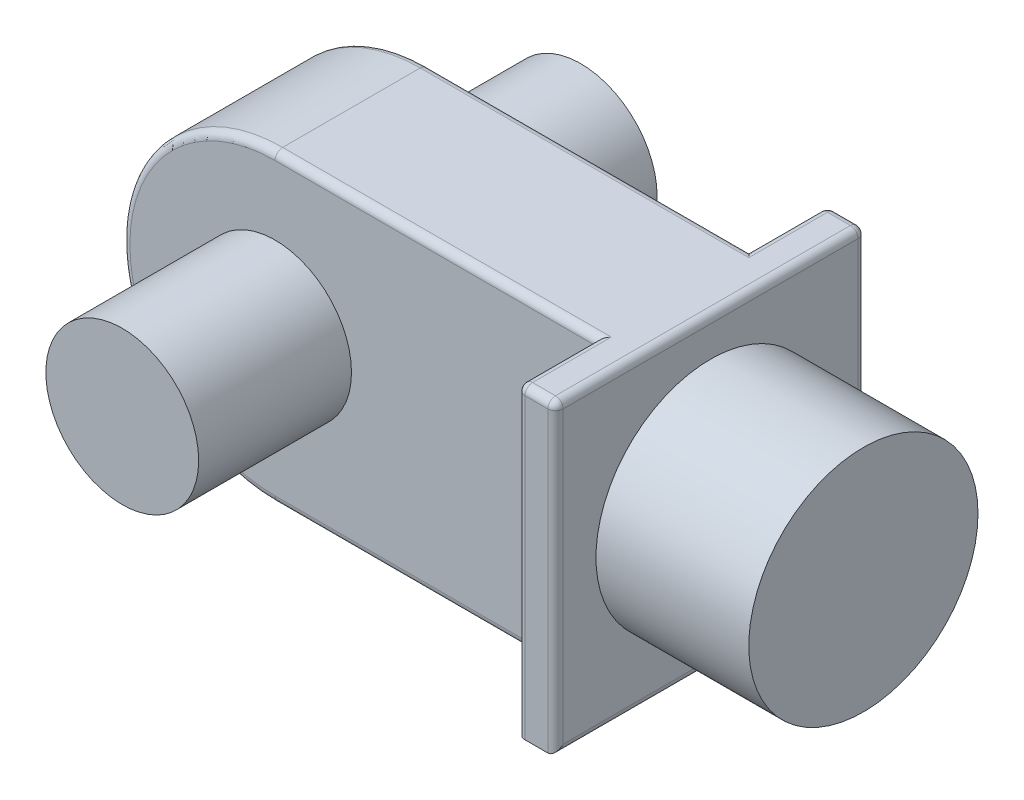
ISO-10303-21;
HEADER;
FILE_DESCRIPTION(('STEP AP214'),'2;1');
FILE_NAME('part.step','',(''),(''),'','','');
FILE_SCHEMA(('AUTOMOTIVE_DESIGN { 1 0 10303 214 1 1 1 1 }'));
ENDSEC;
DATA;
#1=APPLICATION_CONTEXT('core data for automotive mechanical design processes');
#2=APPLICATION_PROTOCOL_DEFINITION('international standard','automotive_design',2000,#1);
#3=PRODUCT_CONTEXT('',#1,'mechanical');
#4=PRODUCT('Part','Part','',(#3));
#5=PRODUCT_RELATED_PRODUCT_CATEGORY('part','',(#4));
#6=PRODUCT_DEFINITION_FORMATION('','',#4);
#7=PRODUCT_DEFINITION_CONTEXT('part definition',#1,'design');
#8=PRODUCT_DEFINITION('design','',#6,#7);
#9=PRODUCT_DEFINITION_SHAPE('','',#8);
#10=(LENGTH_UNIT() NAMED_UNIT(*) SI_UNIT(.MILLI.,.METRE.));
#11=(NAMED_UNIT(*) PLANE_ANGLE_UNIT() SI_UNIT($,.RADIAN.));
#12=(NAMED_UNIT(*) SI_UNIT($,.STERADIAN.) SOLID_ANGLE_UNIT());
#13=UNCERTAINTY_MEASURE_WITH_UNIT(LENGTH_MEASURE(1.E-05),#10,'distance_accuracy_value','');
#14=(GEOMETRIC_REPRESENTATION_CONTEXT(3) GLOBAL_UNCERTAINTY_ASSIGNED_CONTEXT((#13)) GLOBAL_UNIT_ASSIGNED_CONTEXT((#10,
#11,#12)) REPRESENTATION_CONTEXT('',''));
#15=CARTESIAN_POINT('',(0.,0.,0.));
#16=DIRECTION('',(0.,0.,1.));
#17=DIRECTION('',(1.,0.,0.));
#18=AXIS2_PLACEMENT_3D('',#15,#16,#17);
#19=CARTESIAN_POINT('',(-24.5588909208739,-0.00123831876589259,11.9999932178254));
#20=DIRECTION('',(0.,0.,-1.));
#21=DIRECTION('',(-1.,0.,0.));
#22=AXIS2_PLACEMENT_3D('',#19,#20,#21);
#23=CYLINDRICAL_SURFACE('',#22,4.);
#24=DIRECTION('',(0.,0.,-1.));
#25=VECTOR('',#24,1.);
#26=CARTESIAN_POINT('',(-24.5588909208739,-4.00123831876589,11.9999932178254));
#27=LINE('',#26,#25);
#28=CARTESIAN_POINT('',(-24.5588909208739,-4.00123831876589,11.7999932178254));
#29=VERTEX_POINT('',#28);
#30=CARTESIAN_POINT('',(-24.5588909208739,-4.00123831876589,8.19999321782536));
#31=VERTEX_POINT('',#30);
#32=EDGE_CURVE('E204',#29,#31,#27,.T.);
#33=ORIENTED_EDGE('',*,*,#32,.F.);
#34=CARTESIAN_POINT('',(-24.5588909208739,-0.00123831876589259,11.7999932178254));
#35=DIRECTION('',(0.,0.,1.));
#36=DIRECTION('',(1.,0.,0.));
#37=AXIS2_PLACEMENT_3D('',#34,#35,#36);
#38=CIRCLE('',#37,4.);
#39=CARTESIAN_POINT('',(-24.5588909208739,3.99876168123411,11.7999932178254));
#40=VERTEX_POINT('',#39);
#41=EDGE_CURVE('E239',#29,#40,#38,.F.);
#42=ORIENTED_EDGE('',*,*,#41,.T.);
#43=DIRECTION('',(0.,0.,-1.));
#44=VECTOR('',#43,1.);
#45=CARTESIAN_POINT('',(-24.5588909208739,3.99876168123411,11.9999932178254));
#46=LINE('',#45,#44);
#47=CARTESIAN_POINT('',(-24.5588909208739,3.99876168123411,8.19999321782536));
#48=VERTEX_POINT('',#47);
#49=EDGE_CURVE('E198',#40,#48,#46,.T.);
#50=ORIENTED_EDGE('',*,*,#49,.T.);
#51=CARTESIAN_POINT('',(-24.5588909208739,-0.00123831876589259,8.19999321782536));
#52=DIRECTION('',(0.,0.,1.));
#53=DIRECTION('',(1.,0.,0.));
#54=AXIS2_PLACEMENT_3D('',#51,#52,#53);
#55=CIRCLE('',#54,4.);
#56=EDGE_CURVE('E236',#48,#31,#55,.T.);
#57=ORIENTED_EDGE('',*,*,#56,.T.);
#58=EDGE_LOOP('',(#33,#42,#50,#57));
#59=FACE_BOUND('',#58,.T.);
#60=ADVANCED_FACE('F45',(#59),#23,.T.);
#61=CARTESIAN_POINT('',(-24.5588909208739,-4.00123831876589,11.9999932178254));
#62=DIRECTION('',(0.,1.,0.));
#63=DIRECTION('',(0.,0.,1.));
#64=AXIS2_PLACEMENT_3D('',#61,#62,#63);
#65=PLANE('',#64);
#66=DIRECTION('',(0.,0.,-1.));
#67=VECTOR('',#66,1.);
#68=CARTESIAN_POINT('',(-16.1588909208739,-4.00123831876589,14.0597878846235));
#69=LINE('',#68,#67);
#70=CARTESIAN_POINT('',(-16.1588909208739,-4.00123831876589,13.8597878846235));
#71=VERTEX_POINT('',#70);
#72=CARTESIAN_POINT('',(-16.1588909208739,-4.00123831876589,11.7999932178254));
#73=VERTEX_POINT('',#72);
#74=EDGE_CURVE('E403',#71,#73,#69,.T.);
#75=ORIENTED_EDGE('',*,*,#74,.T.);
#76=DIRECTION('',(1.,0.,0.));
#77=VECTOR('',#76,1.);
#78=CARTESIAN_POINT('',(-24.5588909208739,-4.00123831876589,11.7999932178254));
#79=LINE('',#78,#77);
#80=EDGE_CURVE('E179',#73,#29,#79,.F.);
#81=ORIENTED_EDGE('',*,*,#80,.T.);
#82=ORIENTED_EDGE('',*,*,#32,.T.);
#83=DIRECTION('',(1.,0.,0.));
#84=VECTOR('',#83,1.);
#85=CARTESIAN_POINT('',(-24.5588909208739,-4.00123831876589,8.19999321782536));
#86=LINE('',#85,#84);
#87=CARTESIAN_POINT('',(-16.1588909208739,-4.00123831876589,8.19999321782536));
#88=VERTEX_POINT('',#87);
#89=EDGE_CURVE('E230',#31,#88,#86,.T.);
#90=ORIENTED_EDGE('',*,*,#89,.T.);
#91=CARTESIAN_POINT('',(-16.1588909208739,-4.00123831876589,6.14019855102719));
#92=VERTEX_POINT('',#91);
#93=EDGE_CURVE('E397',#88,#92,#69,.T.);
#94=ORIENTED_EDGE('',*,*,#93,.T.);
#95=CARTESIAN_POINT('',(-15.9588909208739,-4.00123831876589,6.14019855102719));
#96=DIRECTION('',(0.,1.,0.));
#97=DIRECTION('',(0.,0.,1.));
#98=AXIS2_PLACEMENT_3D('',#95,#96,#97);
#99=CIRCLE('',#98,0.2);
#100=CARTESIAN_POINT('',(-15.9588909208739,-4.00123831876589,5.94019855102718));
#101=VERTEX_POINT('',#100);
#102=EDGE_CURVE('E193',#92,#101,#99,.F.);
#103=ORIENTED_EDGE('',*,*,#102,.T.);
#104=DIRECTION('',(-1.,0.,0.));
#105=VECTOR('',#104,1.);
#106=CARTESIAN_POINT('',(-15.1588909208739,-4.00123831876589,5.94019855102718));
#107=LINE('',#106,#105);
#108=CARTESIAN_POINT('',(-15.3588909208739,-4.00123831876589,5.94019855102718));
#109=VERTEX_POINT('',#108);
#110=EDGE_CURVE('E410',#109,#101,#107,.T.);
#111=ORIENTED_EDGE('',*,*,#110,.F.);
#112=DIRECTION('',(0.,0.,-1.));
#113=VECTOR('',#112,1.);
#114=CARTESIAN_POINT('',(-15.3588909208739,-4.00123831876589,14.0597878846235));
#115=LINE('',#114,#113);
#116=CARTESIAN_POINT('',(-15.3588909208739,-4.00123831876589,14.0597878846235));
#117=VERTEX_POINT('',#116);
#118=EDGE_CURVE('E227',#109,#117,#115,.F.);
#119=ORIENTED_EDGE('',*,*,#118,.T.);
#120=DIRECTION('',(-1.,0.,0.));
#121=VECTOR('',#120,1.);
#122=CARTESIAN_POINT('',(-15.1588909208739,-4.00123831876589,14.0597878846235));
#123=LINE('',#122,#121);
#124=CARTESIAN_POINT('',(-15.9588909208739,-4.00123831876589,14.0597878846235));
#125=VERTEX_POINT('',#124);
#126=EDGE_CURVE('E414',#117,#125,#123,.T.);
#127=ORIENTED_EDGE('',*,*,#126,.T.);
#128=CARTESIAN_POINT('',(-15.9588909208739,-4.00123831876589,13.8597878846235));
#129=DIRECTION('',(0.,1.,0.));
#130=DIRECTION('',(0.,0.,1.));
#131=AXIS2_PLACEMENT_3D('',#128,#129,#130);
#132=CIRCLE('',#131,0.2);
#133=EDGE_CURVE('E224',#125,#71,#132,.F.);
#134=ORIENTED_EDGE('',*,*,#133,.T.);
#135=EDGE_LOOP('',(#75,#81,#82,#90,#94,#103,#111,#119,#127,#134));
#136=FACE_BOUND('',#135,.T.);
#137=ADVANCED_FACE('F449',(#136),#65,.F.);
#138=CARTESIAN_POINT('',(-24.5588909208739,3.99876168123411,11.9999932178254));
#139=DIRECTION('',(0.,-1.,0.));
#140=DIRECTION('',(0.,0.,-1.));
#141=AXIS2_PLACEMENT_3D('',#138,#139,#140);
#142=PLANE('',#141);
#143=ORIENTED_EDGE('',*,*,#49,.F.);
#144=DIRECTION('',(-1.,0.,0.));
#145=VECTOR('',#144,1.);
#146=CARTESIAN_POINT('',(-16.1588909208739,3.99876168123411,11.7999932178254));
#147=LINE('',#146,#145);
#148=CARTESIAN_POINT('',(-15.9588909208739,3.99876168123411,11.7999932178254));
#149=VERTEX_POINT('',#148);
#150=EDGE_CURVE('E269',#40,#149,#147,.F.);
#151=ORIENTED_EDGE('',*,*,#150,.T.);
#152=DIRECTION('',(0.,0.,1.));
#153=VECTOR('',#152,1.);
#154=CARTESIAN_POINT('',(-15.9588909208739,3.99876168123411,11.9999932178254));
#155=LINE('',#154,#153);
#156=CARTESIAN_POINT('',(-15.9588909208739,3.99876168123411,13.8597878846235));
#157=VERTEX_POINT('',#156);
#158=EDGE_CURVE('E266',#149,#157,#155,.T.);
#159=ORIENTED_EDGE('',*,*,#158,.T.);
#160=DIRECTION('',(-1.,0.,0.));
#161=VECTOR('',#160,1.);
#162=CARTESIAN_POINT('',(-24.5588909208739,3.99876168123411,13.8597878846235));
#163=LINE('',#162,#161);
#164=CARTESIAN_POINT('',(-15.3588909208739,3.99876168123411,13.8597878846235));
#165=VERTEX_POINT('',#164);
#166=EDGE_CURVE('E263',#157,#165,#163,.F.);
#167=ORIENTED_EDGE('',*,*,#166,.T.);
#168=DIRECTION('',(0.,0.,1.));
#169=VECTOR('',#168,1.);
#170=CARTESIAN_POINT('',(-15.3588909208739,3.99876168123411,5.94019855102718));
#171=LINE('',#170,#169);
#172=CARTESIAN_POINT('',(-15.3588909208739,3.99876168123411,6.14019855102719));
#173=VERTEX_POINT('',#172);
#174=EDGE_CURVE('E260',#165,#173,#171,.F.);
#175=ORIENTED_EDGE('',*,*,#174,.T.);
#176=DIRECTION('',(-1.,0.,0.));
#177=VECTOR('',#176,1.);
#178=CARTESIAN_POINT('',(-24.5588909208739,3.99876168123411,6.14019855102719));
#179=LINE('',#178,#177);
#180=CARTESIAN_POINT('',(-15.9588909208739,3.99876168123411,6.14019855102719));
#181=VERTEX_POINT('',#180);
#182=EDGE_CURVE('E257',#173,#181,#179,.T.);
#183=ORIENTED_EDGE('',*,*,#182,.T.);
#184=DIRECTION('',(0.,0.,1.));
#185=VECTOR('',#184,1.);
#186=CARTESIAN_POINT('',(-15.9588909208739,3.99876168123411,11.9999932178254));
#187=LINE('',#186,#185);
#188=CARTESIAN_POINT('',(-15.9588909208739,3.99876168123411,8.19999321782536));
#189=VERTEX_POINT('',#188);
#190=EDGE_CURVE('E254',#181,#189,#187,.T.);
#191=ORIENTED_EDGE('',*,*,#190,.T.);
#192=DIRECTION('',(-1.,0.,0.));
#193=VECTOR('',#192,1.);
#194=CARTESIAN_POINT('',(-24.5588909208739,3.99876168123411,8.19999321782536));
#195=LINE('',#194,#193);
#196=EDGE_CURVE('E251',#189,#48,#195,.T.);
#197=ORIENTED_EDGE('',*,*,#196,.T.);
#198=EDGE_LOOP('',(#143,#151,#159,#167,#175,#183,#191,#197));
#199=FACE_BOUND('',#198,.T.);
#200=ADVANCED_FACE('F441',(#199),#142,.F.);
#201=CARTESIAN_POINT('',(-24.5588909208739,-0.00123831876589259,11.9999932178254));
#202=DIRECTION('',(0.,0.,1.));
#203=DIRECTION('',(1.,0.,0.));
#204=AXIS2_PLACEMENT_3D('',#201,#202,#203);
#205=PLANE('',#204);
#206=CARTESIAN_POINT('',(-24.5588909208739,-0.00123831876589259,11.9999932178254));
#207=DIRECTION('',(0.,0.,1.));
#208=DIRECTION('',(1.,0.,0.));
#209=AXIS2_PLACEMENT_3D('',#206,#207,#208);
#210=CIRCLE('',#209,2.);
#211=CARTESIAN_POINT('',(-22.5588909208739,-0.00123831876589259,11.9999932178254));
#212=VERTEX_POINT('',#211);
#213=EDGE_CURVE('E210',#212,#212,#210,.T.);
#214=ORIENTED_EDGE('',*,*,#213,.F.);
#215=EDGE_LOOP('',(#214));
#216=FACE_BOUND('',#215,.T.);
#217=CARTESIAN_POINT('',(-24.5588909208739,-0.00123831876589259,11.9999932178254));
#218=DIRECTION('',(0.,0.,1.));
#219=DIRECTION('',(1.,0.,0.));
#220=AXIS2_PLACEMENT_3D('',#217,#218,#219);
#221=CIRCLE('',#220,3.8);
#222=CARTESIAN_POINT('',(-24.5588909208739,3.79876168123411,11.9999932178254));
#223=VERTEX_POINT('',#222);
#224=CARTESIAN_POINT('',(-24.5588909208739,-3.80123831876589,11.9999932178254));
#225=VERTEX_POINT('',#224);
#226=EDGE_CURVE('E190',#223,#225,#221,.T.);
#227=ORIENTED_EDGE('',*,*,#226,.T.);
#228=DIRECTION('',(1.,0.,0.));
#229=VECTOR('',#228,1.);
#230=CARTESIAN_POINT('',(-16.1588909208739,-3.80123831876589,11.9999932178254));
#231=LINE('',#230,#229);
#232=CARTESIAN_POINT('',(-16.1588909208739,-3.80123831876589,11.9999932178254));
#233=VERTEX_POINT('',#232);
#234=EDGE_CURVE('E178',#225,#233,#231,.T.);
#235=ORIENTED_EDGE('',*,*,#234,.T.);
#236=DIRECTION('',(0.,1.,0.));
#237=VECTOR('',#236,1.);
#238=CARTESIAN_POINT('',(-16.1588909208739,-4.00123831876589,11.9999932178254));
#239=LINE('',#238,#237);
#240=CARTESIAN_POINT('',(-16.1588909208739,3.79876168123411,11.9999932178254));
#241=VERTEX_POINT('',#240);
#242=EDGE_CURVE('E187',#233,#241,#239,.T.);
#243=ORIENTED_EDGE('',*,*,#242,.T.);
#244=DIRECTION('',(-1.,0.,0.));
#245=VECTOR('',#244,1.);
#246=CARTESIAN_POINT('',(-24.5588909208739,3.79876168123411,11.9999932178254));
#247=LINE('',#246,#245);
#248=EDGE_CURVE('E216',#241,#223,#247,.T.);
#249=ORIENTED_EDGE('',*,*,#248,.T.);
#250=EDGE_LOOP('',(#227,#235,#243,#249));
#251=FACE_BOUND('',#250,.T.);
#252=ADVANCED_FACE('F186',(#216,#251),#205,.T.);
#253=CARTESIAN_POINT('',(-24.5588909208739,-0.00123831876589259,7.99999321782536));
#254=DIRECTION('',(0.,0.,1.));
#255=DIRECTION('',(1.,0.,0.));
#256=AXIS2_PLACEMENT_3D('',#253,#254,#255);
#257=PLANE('',#256);
#258=CARTESIAN_POINT('',(-24.5588909208739,-0.00123831876589259,7.99999321782536));
#259=DIRECTION('',(0.,0.,1.));
#260=DIRECTION('',(1.,0.,0.));
#261=AXIS2_PLACEMENT_3D('',#258,#259,#260);
#262=CIRCLE('',#261,2.);
#263=CARTESIAN_POINT('',(-22.5588909208739,-0.00123831876589259,7.99999321782536));
#264=VERTEX_POINT('',#263);
#265=EDGE_CURVE('E418',#264,#264,#262,.T.);
#266=ORIENTED_EDGE('',*,*,#265,.T.);
#267=EDGE_LOOP('',(#266));
#268=FACE_BOUND('',#267,.T.);
#269=DIRECTION('',(0.,1.,0.));
#270=VECTOR('',#269,1.);
#271=CARTESIAN_POINT('',(-16.1588909208739,-4.00123831876589,7.99999321782536));
#272=LINE('',#271,#270);
#273=CARTESIAN_POINT('',(-16.1588909208739,-3.80123831876589,7.99999321782536));
#274=VERTEX_POINT('',#273);
#275=CARTESIAN_POINT('',(-16.1588909208739,3.79876168123411,7.99999321782536));
#276=VERTEX_POINT('',#275);
#277=EDGE_CURVE('E199',#274,#276,#272,.T.);
#278=ORIENTED_EDGE('',*,*,#277,.F.);
#279=DIRECTION('',(1.,0.,0.));
#280=VECTOR('',#279,1.);
#281=CARTESIAN_POINT('',(-24.5588909208739,-3.80123831876589,7.99999321782536));
#282=LINE('',#281,#280);
#283=CARTESIAN_POINT('',(-24.5588909208739,-3.80123831876589,7.99999321782536));
#284=VERTEX_POINT('',#283);
#285=EDGE_CURVE('E248',#274,#284,#282,.F.);
#286=ORIENTED_EDGE('',*,*,#285,.T.);
#287=CARTESIAN_POINT('',(-24.5588909208739,-0.00123831876589259,7.99999321782536));
#288=DIRECTION('',(0.,0.,1.));
#289=DIRECTION('',(1.,0.,0.));
#290=AXIS2_PLACEMENT_3D('',#287,#288,#289);
#291=CIRCLE('',#290,3.8);
#292=CARTESIAN_POINT('',(-24.5588909208739,3.79876168123411,7.99999321782536));
#293=VERTEX_POINT('',#292);
#294=EDGE_CURVE('E245',#284,#293,#291,.F.);
#295=ORIENTED_EDGE('',*,*,#294,.T.);
#296=DIRECTION('',(-1.,0.,0.));
#297=VECTOR('',#296,1.);
#298=CARTESIAN_POINT('',(-24.5588909208739,3.79876168123411,7.99999321782536));
#299=LINE('',#298,#297);
#300=EDGE_CURVE('E242',#293,#276,#299,.F.);
#301=ORIENTED_EDGE('',*,*,#300,.T.);
#302=EDGE_LOOP('',(#278,#286,#295,#301));
#303=FACE_BOUND('',#302,.T.);
#304=ADVANCED_FACE('F434',(#268,#303),#257,.F.);
#305=CARTESIAN_POINT('',(-24.5588909208739,-0.00123831876589259,15.9999932178254));
#306=DIRECTION('',(0.,0.,-1.));
#307=DIRECTION('',(-1.,0.,0.));
#308=AXIS2_PLACEMENT_3D('',#305,#306,#307);
#309=CYLINDRICAL_SURFACE('',#308,2.);
#310=CARTESIAN_POINT('',(-24.5588909208739,-0.00123831876589259,15.9999932178254));
#311=DIRECTION('',(0.,0.,1.));
#312=DIRECTION('',(1.,0.,0.));
#313=AXIS2_PLACEMENT_3D('',#310,#311,#312);
#314=CIRCLE('',#313,2.);
#315=CARTESIAN_POINT('',(-22.5588909208739,-0.00123831876589259,15.9999932178254));
#316=VERTEX_POINT('',#315);
#317=EDGE_CURVE('E207',#316,#316,#314,.T.);
#318=ORIENTED_EDGE('',*,*,#317,.F.);
#319=EDGE_LOOP('',(#318));
#320=FACE_BOUND('',#319,.T.);
#321=ORIENTED_EDGE('',*,*,#213,.T.);
#322=EDGE_LOOP('',(#321));
#323=FACE_BOUND('',#322,.T.);
#324=ADVANCED_FACE('F431',(#320,#323),#309,.T.);
#325=CARTESIAN_POINT('',(-24.5588909208739,-0.00123831876589259,15.9999932178254));
#326=DIRECTION('',(0.,0.,1.));
#327=DIRECTION('',(1.,0.,0.));
#328=AXIS2_PLACEMENT_3D('',#325,#326,#327);
#329=PLANE('',#328);
#330=ORIENTED_EDGE('',*,*,#317,.T.);
#331=EDGE_LOOP('',(#330));
#332=FACE_BOUND('',#331,.T.);
#333=ADVANCED_FACE('F429',(#332),#329,.T.);
#334=CARTESIAN_POINT('',(-24.5588909208739,-0.00123831876589259,3.99999321782536));
#335=DIRECTION('',(0.,0.,1.));
#336=DIRECTION('',(1.,0.,0.));
#337=AXIS2_PLACEMENT_3D('',#334,#335,#336);
#338=CYLINDRICAL_SURFACE('',#337,2.);
#339=CARTESIAN_POINT('',(-24.5588909208739,-0.00123831876589259,3.99999321782536));
#340=DIRECTION('',(0.,0.,1.));
#341=DIRECTION('',(1.,0.,0.));
#342=AXIS2_PLACEMENT_3D('',#339,#340,#341);
#343=CIRCLE('',#342,2.);
#344=CARTESIAN_POINT('',(-22.5588909208739,-0.00123831876589259,3.99999321782536));
#345=VERTEX_POINT('',#344);
#346=EDGE_CURVE('E419',#345,#345,#343,.T.);
#347=ORIENTED_EDGE('',*,*,#346,.T.);
#348=EDGE_LOOP('',(#347));
#349=FACE_BOUND('',#348,.T.);
#350=ORIENTED_EDGE('',*,*,#265,.F.);
#351=EDGE_LOOP('',(#350));
#352=FACE_BOUND('',#351,.T.);
#353=ADVANCED_FACE('F606',(#349,#352),#338,.T.);
#354=CARTESIAN_POINT('',(-24.5588909208739,-0.00123831876589259,3.99999321782536));
#355=DIRECTION('',(0.,0.,-1.));
#356=DIRECTION('',(1.,0.,0.));
#357=AXIS2_PLACEMENT_3D('',#354,#355,#356);
#358=PLANE('',#357);
#359=ORIENTED_EDGE('',*,*,#346,.F.);
#360=EDGE_LOOP('',(#359));
#361=FACE_BOUND('',#360,.T.);
#362=ADVANCED_FACE('F603',(#361),#358,.T.);
#363=CARTESIAN_POINT('',(-16.1588909208739,-0.00123831876589259,7.99999321782536));
#364=DIRECTION('',(1.,0.,0.));
#365=DIRECTION('',(0.,0.,-1.));
#366=AXIS2_PLACEMENT_3D('',#363,#364,#365);
#367=PLANE('',#366);
#368=ORIENTED_EDGE('',*,*,#277,.T.);
#369=DIRECTION('',(0.,0.,1.));
#370=VECTOR('',#369,1.);
#371=CARTESIAN_POINT('',(-16.1588909208739,3.79876168123411,7.99999321782536));
#372=LINE('',#371,#370);
#373=CARTESIAN_POINT('',(-16.1588909208739,3.79876168123411,6.14019855102719));
#374=VERTEX_POINT('',#373);
#375=EDGE_CURVE('E275',#276,#374,#372,.F.);
#376=ORIENTED_EDGE('',*,*,#375,.T.);
#377=DIRECTION('',(0.,1.,0.));
#378=VECTOR('',#377,1.);
#379=CARTESIAN_POINT('',(-16.1588909208739,-0.00123831876589259,6.14019855102719));
#380=LINE('',#379,#378);
#381=EDGE_CURVE('E272',#374,#92,#380,.F.);
#382=ORIENTED_EDGE('',*,*,#381,.T.);
#383=ORIENTED_EDGE('',*,*,#93,.F.);
#384=CARTESIAN_POINT('',(-16.1588909208739,-3.80123831876589,8.19999321782536));
#385=DIRECTION('',(1.,0.,0.));
#386=DIRECTION('',(0.,0.,-1.));
#387=AXIS2_PLACEMENT_3D('',#384,#385,#386);
#388=CIRCLE('',#387,0.2);
#389=EDGE_CURVE('E11',#88,#274,#388,.T.);
#390=ORIENTED_EDGE('',*,*,#389,.T.);
#391=EDGE_LOOP('',(#368,#376,#382,#383,#390));
#392=FACE_BOUND('',#391,.T.);
#393=ADVANCED_FACE('F547',(#392),#367,.F.);
#394=CARTESIAN_POINT('',(-15.1588909208739,3.99876168123411,5.94019855102718));
#395=DIRECTION('',(0.,0.,1.));
#396=DIRECTION('',(1.,0.,0.));
#397=AXIS2_PLACEMENT_3D('',#394,#395,#396);
#398=PLANE('',#397);
#399=DIRECTION('',(-1.,0.,0.));
#400=VECTOR('',#399,1.);
#401=CARTESIAN_POINT('',(-15.1588909208739,3.79876168123411,5.94019855102718));
#402=LINE('',#401,#400);
#403=CARTESIAN_POINT('',(-15.9588909208739,3.79876168123411,5.94019855102718));
#404=VERTEX_POINT('',#403);
#405=CARTESIAN_POINT('',(-15.3588909208739,3.79876168123411,5.94019855102718));
#406=VERTEX_POINT('',#405);
#407=EDGE_CURVE('E281',#404,#406,#402,.F.);
#408=ORIENTED_EDGE('',*,*,#407,.T.);
#409=DIRECTION('',(0.,1.,0.));
#410=VECTOR('',#409,1.);
#411=CARTESIAN_POINT('',(-15.3588909208739,-4.00123831876589,5.94019855102718));
#412=LINE('',#411,#410);
#413=EDGE_CURVE('E284',#406,#109,#412,.F.);
#414=ORIENTED_EDGE('',*,*,#413,.T.);
#415=ORIENTED_EDGE('',*,*,#110,.T.);
#416=DIRECTION('',(0.,1.,0.));
#417=VECTOR('',#416,1.);
#418=CARTESIAN_POINT('',(-15.9588909208739,3.99876168123411,5.94019855102718));
#419=LINE('',#418,#417);
#420=EDGE_CURVE('E278',#101,#404,#419,.T.);
#421=ORIENTED_EDGE('',*,*,#420,.T.);
#422=EDGE_LOOP('',(#408,#414,#415,#421));
#423=FACE_BOUND('',#422,.T.);
#424=ADVANCED_FACE('F561',(#423),#398,.F.);
#425=CARTESIAN_POINT('',(-15.1588909208739,3.99876168123411,14.0597878846235));
#426=DIRECTION('',(0.,0.,-1.));
#427=DIRECTION('',(-1.,0.,0.));
#428=AXIS2_PLACEMENT_3D('',#425,#426,#427);
#429=PLANE('',#428);
#430=ORIENTED_EDGE('',*,*,#126,.F.);
#431=DIRECTION('',(0.,-1.,0.));
#432=VECTOR('',#431,1.);
#433=CARTESIAN_POINT('',(-15.3588909208739,3.99876168123411,14.0597878846235));
#434=LINE('',#433,#432);
#435=CARTESIAN_POINT('',(-15.3588909208739,3.79876168123411,14.0597878846235));
#436=VERTEX_POINT('',#435);
#437=EDGE_CURVE('E71',#117,#436,#434,.F.);
#438=ORIENTED_EDGE('',*,*,#437,.T.);
#439=DIRECTION('',(-1.,0.,0.));
#440=VECTOR('',#439,1.);
#441=CARTESIAN_POINT('',(-15.1588909208739,3.79876168123411,14.0597878846235));
#442=LINE('',#441,#440);
#443=CARTESIAN_POINT('',(-15.9588909208739,3.79876168123411,14.0597878846235));
#444=VERTEX_POINT('',#443);
#445=EDGE_CURVE('E303',#436,#444,#442,.T.);
#446=ORIENTED_EDGE('',*,*,#445,.T.);
#447=DIRECTION('',(0.,-1.,0.));
#448=VECTOR('',#447,1.);
#449=CARTESIAN_POINT('',(-15.9588909208739,3.99876168123411,14.0597878846235));
#450=LINE('',#449,#448);
#451=EDGE_CURVE('E300',#444,#125,#450,.T.);
#452=ORIENTED_EDGE('',*,*,#451,.T.);
#453=EDGE_LOOP('',(#430,#438,#446,#452));
#454=FACE_BOUND('',#453,.T.);
#455=ADVANCED_FACE('F580',(#454),#429,.F.);
#456=CARTESIAN_POINT('',(-15.1588909208739,-0.00123831876589259,7.99999321782536));
#457=DIRECTION('',(1.,0.,0.));
#458=DIRECTION('',(0.,0.,-1.));
#459=AXIS2_PLACEMENT_3D('',#456,#457,#458);
#460=PLANE('',#459);
#461=DIRECTION('',(0.,1.,0.));
#462=VECTOR('',#461,1.);
#463=CARTESIAN_POINT('',(-15.1588909208739,3.99876168123411,6.14019855102719));
#464=LINE('',#463,#462);
#465=CARTESIAN_POINT('',(-15.1588909208739,-3.80123831876589,6.14019855102719));
#466=VERTEX_POINT('',#465);
#467=CARTESIAN_POINT('',(-15.1588909208739,3.79876168123411,6.14019855102719));
#468=VERTEX_POINT('',#467);
#469=EDGE_CURVE('E290',#466,#468,#464,.T.);
#470=ORIENTED_EDGE('',*,*,#469,.T.);
#471=DIRECTION('',(0.,0.,1.));
#472=VECTOR('',#471,1.);
#473=CARTESIAN_POINT('',(-15.1588909208739,3.79876168123411,14.0597878846235));
#474=LINE('',#473,#472);
#475=CARTESIAN_POINT('',(-15.1588909208739,3.79876168123411,13.8597878846235));
#476=VERTEX_POINT('',#475);
#477=EDGE_CURVE('E296',#468,#476,#474,.T.);
#478=ORIENTED_EDGE('',*,*,#477,.T.);
#479=DIRECTION('',(0.,-1.,0.));
#480=VECTOR('',#479,1.);
#481=CARTESIAN_POINT('',(-15.1588909208739,-4.00123831876589,13.8597878846235));
#482=LINE('',#481,#480);
#483=CARTESIAN_POINT('',(-15.1588909208739,-3.80123831876589,13.8597878846235));
#484=VERTEX_POINT('',#483);
#485=EDGE_CURVE('E293',#476,#484,#482,.T.);
#486=ORIENTED_EDGE('',*,*,#485,.T.);
#487=DIRECTION('',(0.,0.,-1.));
#488=VECTOR('',#487,1.);
#489=CARTESIAN_POINT('',(-15.1588909208739,-3.80123831876589,5.94019855102718));
#490=LINE('',#489,#488);
#491=EDGE_CURVE('E287',#484,#466,#490,.T.);
#492=ORIENTED_EDGE('',*,*,#491,.T.);
#493=EDGE_LOOP('',(#470,#478,#486,#492));
#494=FACE_BOUND('',#493,.T.);
#495=CARTESIAN_POINT('',(-15.1588909208739,-0.00123831876589189,9.99999321782536));
#496=DIRECTION('',(1.,0.,0.));
#497=DIRECTION('',(0.,0.,-1.));
#498=AXIS2_PLACEMENT_3D('',#495,#496,#497);
#499=CIRCLE('',#498,3.);
#500=CARTESIAN_POINT('',(-15.1588909208739,-0.00123831876589189,6.99999321782536));
#501=VERTEX_POINT('',#500);
#502=EDGE_CURVE('E219',#501,#501,#499,.T.);
#503=ORIENTED_EDGE('',*,*,#502,.F.);
#504=EDGE_LOOP('',(#503));
#505=FACE_BOUND('',#504,.T.);
#506=ADVANCED_FACE('F575',(#494,#505),#460,.T.);
#507=DIRECTION('',(0.,-1.,0.));
#508=VECTOR('',#507,1.);
#509=CARTESIAN_POINT('',(-16.1588909208739,-0.00123831876589259,13.8597878846235));
#510=LINE('',#509,#508);
#511=CARTESIAN_POINT('',(-16.1588909208739,3.79876168123411,13.8597878846235));
#512=VERTEX_POINT('',#511);
#513=EDGE_CURVE('E63',#71,#512,#510,.F.);
#514=ORIENTED_EDGE('',*,*,#513,.T.);
#515=DIRECTION('',(0.,0.,1.));
#516=VECTOR('',#515,1.);
#517=CARTESIAN_POINT('',(-16.1588909208739,3.79876168123411,7.99999321782536));
#518=LINE('',#517,#516);
#519=EDGE_CURVE('E182',#512,#241,#518,.F.);
#520=ORIENTED_EDGE('',*,*,#519,.T.);
#521=ORIENTED_EDGE('',*,*,#242,.F.);
#522=CARTESIAN_POINT('',(-16.1588909208739,-3.80123831876589,11.7999932178254));
#523=DIRECTION('',(1.,0.,0.));
#524=DIRECTION('',(0.,0.,-1.));
#525=AXIS2_PLACEMENT_3D('',#522,#523,#524);
#526=CIRCLE('',#525,0.2);
#527=EDGE_CURVE('E55',#233,#73,#526,.T.);
#528=ORIENTED_EDGE('',*,*,#527,.T.);
#529=ORIENTED_EDGE('',*,*,#74,.F.);
#530=EDGE_LOOP('',(#514,#520,#521,#528,#529));
#531=FACE_BOUND('',#530,.T.);
#532=ADVANCED_FACE('F195',(#531),#367,.F.);
#533=CARTESIAN_POINT('',(-11.1588909208739,-0.00123831876589189,9.99999321782536));
#534=DIRECTION('',(-1.,0.,0.));
#535=DIRECTION('',(0.,0.,1.));
#536=AXIS2_PLACEMENT_3D('',#533,#534,#535);
#537=CYLINDRICAL_SURFACE('',#536,3.);
#538=CARTESIAN_POINT('',(-11.1588909208739,-0.00123831876589189,9.99999321782536));
#539=DIRECTION('',(1.,0.,0.));
#540=DIRECTION('',(0.,0.,-1.));
#541=AXIS2_PLACEMENT_3D('',#538,#539,#540);
#542=CIRCLE('',#541,3.);
#543=CARTESIAN_POINT('',(-11.1588909208739,-0.00123831876589189,6.99999321782536));
#544=VERTEX_POINT('',#543);
#545=EDGE_CURVE('E390',#544,#544,#542,.T.);
#546=ORIENTED_EDGE('',*,*,#545,.F.);
#547=EDGE_LOOP('',(#546));
#548=FACE_BOUND('',#547,.T.);
#549=ORIENTED_EDGE('',*,*,#502,.T.);
#550=EDGE_LOOP('',(#549));
#551=FACE_BOUND('',#550,.T.);
#552=ADVANCED_FACE('F540',(#548,#551),#537,.T.);
#553=CARTESIAN_POINT('',(-11.1588909208739,-0.00123831876589189,9.99999321782536));
#554=DIRECTION('',(1.,0.,0.));
#555=DIRECTION('',(0.,0.,-1.));
#556=AXIS2_PLACEMENT_3D('',#553,#554,#555);
#557=PLANE('',#556);
#558=ORIENTED_EDGE('',*,*,#545,.T.);
#559=EDGE_LOOP('',(#558));
#560=FACE_BOUND('',#559,.T.);
#561=ADVANCED_FACE('F535',(#560),#557,.T.);
#562=CARTESIAN_POINT('',(-24.5588909208739,-3.80123831876589,8.19999321782536));
#563=DIRECTION('',(1.,0.,0.));
#564=DIRECTION('',(0.,0.,-1.));
#565=AXIS2_PLACEMENT_3D('',#562,#563,#564);
#566=CYLINDRICAL_SURFACE('',#565,0.2);
#567=ORIENTED_EDGE('',*,*,#389,.F.);
#568=ORIENTED_EDGE('',*,*,#89,.F.);
#569=CARTESIAN_POINT('',(-24.5588909208739,-3.80123831876589,8.19999321782536));
#570=DIRECTION('',(-1.,0.,0.));
#571=DIRECTION('',(0.,0.,1.));
#572=AXIS2_PLACEMENT_3D('',#569,#570,#571);
#573=CIRCLE('',#572,0.2);
#574=EDGE_CURVE('E49',#284,#31,#573,.T.);
#575=ORIENTED_EDGE('',*,*,#574,.F.);
#576=ORIENTED_EDGE('',*,*,#285,.F.);
#577=EDGE_LOOP('',(#567,#568,#575,#576));
#578=FACE_BOUND('',#577,.T.);
#579=ADVANCED_FACE('F47',(#578),#566,.T.);
#580=CARTESIAN_POINT('',(-24.5588909208739,-0.00123831876589259,8.19999321782536));
#581=DIRECTION('',(0.,0.,1.));
#582=DIRECTION('',(1.,0.,0.));
#583=AXIS2_PLACEMENT_3D('',#580,#581,#582);
#584=TOROIDAL_SURFACE('',#583,3.8,0.2);
#585=ORIENTED_EDGE('',*,*,#574,.T.);
#586=ORIENTED_EDGE('',*,*,#56,.F.);
#587=CARTESIAN_POINT('',(-24.5588909208739,3.79876168123411,8.19999321782536));
#588=DIRECTION('',(1.,0.,0.));
#589=DIRECTION('',(0.,0.,-1.));
#590=AXIS2_PLACEMENT_3D('',#587,#588,#589);
#591=CIRCLE('',#590,0.2);
#592=EDGE_CURVE('E381',#293,#48,#591,.T.);
#593=ORIENTED_EDGE('',*,*,#592,.F.);
#594=ORIENTED_EDGE('',*,*,#294,.F.);
#595=EDGE_LOOP('',(#585,#586,#593,#594));
#596=FACE_BOUND('',#595,.T.);
#597=ADVANCED_FACE('F530',(#596),#584,.T.);
#598=CARTESIAN_POINT('',(-24.5588909208739,3.79876168123411,8.19999321782536));
#599=DIRECTION('',(-1.,0.,0.));
#600=DIRECTION('',(0.,0.,1.));
#601=AXIS2_PLACEMENT_3D('',#598,#599,#600);
#602=CYLINDRICAL_SURFACE('',#601,0.2);
#603=ORIENTED_EDGE('',*,*,#592,.T.);
#604=ORIENTED_EDGE('',*,*,#196,.F.);
#605=CARTESIAN_POINT('',(-15.9588909208739,3.79876168123411,8.19999321782536));
#606=DIRECTION('',(-0.707106781186547,0.,0.707106781186547));
#607=DIRECTION('',(0.707106781186547,0.,0.707106781186547));
#608=AXIS2_PLACEMENT_3D('',#605,#606,#607);
#609=ELLIPSE('',#608,0.282842712474619,0.2);
#610=EDGE_CURVE('E378',#276,#189,#609,.F.);
#611=ORIENTED_EDGE('',*,*,#610,.F.);
#612=ORIENTED_EDGE('',*,*,#300,.F.);
#613=EDGE_LOOP('',(#603,#604,#611,#612));
#614=FACE_BOUND('',#613,.T.);
#615=ADVANCED_FACE('F527',(#614),#602,.T.);
#616=CARTESIAN_POINT('',(-15.9588909208739,3.79876168123411,11.9999932178254));
#617=DIRECTION('',(0.,0.,1.));
#618=DIRECTION('',(1.,0.,0.));
#619=AXIS2_PLACEMENT_3D('',#616,#617,#618);
#620=CYLINDRICAL_SURFACE('',#619,0.2);
#621=ORIENTED_EDGE('',*,*,#610,.T.);
#622=ORIENTED_EDGE('',*,*,#190,.F.);
#623=CARTESIAN_POINT('',(-15.9588909208739,3.79876168123411,6.14019855102719));
#624=DIRECTION('',(0.,0.,-1.));
#625=DIRECTION('',(-1.,0.,0.));
#626=AXIS2_PLACEMENT_3D('',#623,#624,#625);
#627=CIRCLE('',#626,0.2);
#628=EDGE_CURVE('E374',#374,#181,#627,.T.);
#629=ORIENTED_EDGE('',*,*,#628,.F.);
#630=ORIENTED_EDGE('',*,*,#375,.F.);
#631=EDGE_LOOP('',(#621,#622,#629,#630));
#632=FACE_BOUND('',#631,.T.);
#633=ADVANCED_FACE('F523',(#632),#620,.T.);
#634=CARTESIAN_POINT('',(-15.9588909208739,3.99876168123411,6.14019855102719));
#635=DIRECTION('',(0.,1.,0.));
#636=DIRECTION('',(0.,0.,1.));
#637=AXIS2_PLACEMENT_3D('',#634,#635,#636);
#638=CYLINDRICAL_SURFACE('',#637,0.2);
#639=ORIENTED_EDGE('',*,*,#102,.F.);
#640=ORIENTED_EDGE('',*,*,#381,.F.);
#641=CARTESIAN_POINT('',(-15.9588909208739,3.79876168123411,6.14019855102719));
#642=DIRECTION('',(0.,1.,0.));
#643=DIRECTION('',(0.,0.,1.));
#644=AXIS2_PLACEMENT_3D('',#641,#642,#643);
#645=CIRCLE('',#644,0.2);
#646=EDGE_CURVE('E370',#404,#374,#645,.T.);
#647=ORIENTED_EDGE('',*,*,#646,.F.);
#648=ORIENTED_EDGE('',*,*,#420,.F.);
#649=EDGE_LOOP('',(#639,#640,#647,#648));
#650=FACE_BOUND('',#649,.T.);
#651=ADVANCED_FACE('F519',(#650),#638,.T.);
#652=CARTESIAN_POINT('',(-15.9588909208739,3.79876168123411,6.14019855102719));
#653=DIRECTION('',(-1.,0.,0.));
#654=DIRECTION('',(0.,0.,1.));
#655=AXIS2_PLACEMENT_3D('',#652,#653,#654);
#656=SPHERICAL_SURFACE('',#655,0.2);
#657=ORIENTED_EDGE('',*,*,#646,.T.);
#658=ORIENTED_EDGE('',*,*,#628,.T.);
#659=CARTESIAN_POINT('',(-15.9588909208739,3.79876168123411,6.14019855102719));
#660=DIRECTION('',(-1.,0.,0.));
#661=DIRECTION('',(0.,0.,1.));
#662=AXIS2_PLACEMENT_3D('',#659,#660,#661);
#663=CIRCLE('',#662,0.2);
#664=EDGE_CURVE('E366',#404,#181,#663,.F.);
#665=ORIENTED_EDGE('',*,*,#664,.F.);
#666=EDGE_LOOP('',(#657,#658,#665));
#667=FACE_BOUND('',#666,.T.);
#668=ADVANCED_FACE('F515',(#667),#656,.T.);
#669=CARTESIAN_POINT('',(-24.5588909208739,3.79876168123411,6.14019855102719));
#670=DIRECTION('',(-1.,0.,0.));
#671=DIRECTION('',(0.,0.,1.));
#672=AXIS2_PLACEMENT_3D('',#669,#670,#671);
#673=CYLINDRICAL_SURFACE('',#672,0.2);
#674=ORIENTED_EDGE('',*,*,#664,.T.);
#675=ORIENTED_EDGE('',*,*,#182,.F.);
#676=CARTESIAN_POINT('',(-15.3588909208739,3.79876168123411,6.14019855102719));
#677=DIRECTION('',(1.,0.,0.));
#678=DIRECTION('',(0.,0.,-1.));
#679=AXIS2_PLACEMENT_3D('',#676,#677,#678);
#680=CIRCLE('',#679,0.2);
#681=EDGE_CURVE('E362',#406,#173,#680,.T.);
#682=ORIENTED_EDGE('',*,*,#681,.F.);
#683=ORIENTED_EDGE('',*,*,#407,.F.);
#684=EDGE_LOOP('',(#674,#675,#682,#683));
#685=FACE_BOUND('',#684,.T.);
#686=ADVANCED_FACE('F511',(#685),#673,.T.);
#687=CARTESIAN_POINT('',(-15.3588909208739,-0.00123831876589259,6.14019855102719));
#688=DIRECTION('',(0.,-1.,0.));
#689=DIRECTION('',(0.,0.,-1.));
#690=AXIS2_PLACEMENT_3D('',#687,#688,#689);
#691=CYLINDRICAL_SURFACE('',#690,0.2);
#692=CARTESIAN_POINT('',(-15.3588909208739,-3.80123831876589,6.14019855102719));
#693=DIRECTION('',(0.,-0.707106781186547,0.707106781186547));
#694=DIRECTION('',(0.,0.707106781186547,0.707106781186547));
#695=AXIS2_PLACEMENT_3D('',#692,#693,#694);
#696=ELLIPSE('',#695,0.282842712474619,0.2);
#697=EDGE_CURVE('E354',#109,#466,#696,.T.);
#698=ORIENTED_EDGE('',*,*,#697,.F.);
#699=ORIENTED_EDGE('',*,*,#413,.F.);
#700=CARTESIAN_POINT('',(-15.3588909208739,3.79876168123411,6.14019855102719));
#701=DIRECTION('',(0.,1.,0.));
#702=DIRECTION('',(0.,0.,1.));
#703=AXIS2_PLACEMENT_3D('',#700,#701,#702);
#704=CIRCLE('',#703,0.2);
#705=EDGE_CURVE('E358',#468,#406,#704,.T.);
#706=ORIENTED_EDGE('',*,*,#705,.F.);
#707=ORIENTED_EDGE('',*,*,#469,.F.);
#708=EDGE_LOOP('',(#698,#699,#706,#707));
#709=FACE_BOUND('',#708,.T.);
#710=ADVANCED_FACE('F507',(#709),#691,.T.);
#711=CARTESIAN_POINT('',(-15.3588909208739,3.79876168123411,6.14019855102719));
#712=DIRECTION('',(0.,0.,-1.));
#713=DIRECTION('',(-1.,0.,0.));
#714=AXIS2_PLACEMENT_3D('',#711,#712,#713);
#715=SPHERICAL_SURFACE('',#714,0.2);
#716=ORIENTED_EDGE('',*,*,#705,.T.);
#717=ORIENTED_EDGE('',*,*,#681,.T.);
#718=CARTESIAN_POINT('',(-15.3588909208739,3.79876168123411,6.14019855102719));
#719=DIRECTION('',(0.,0.,-1.));
#720=DIRECTION('',(-1.,0.,0.));
#721=AXIS2_PLACEMENT_3D('',#718,#719,#720);
#722=CIRCLE('',#721,0.2);
#723=EDGE_CURVE('E350',#468,#173,#722,.F.);
#724=ORIENTED_EDGE('',*,*,#723,.F.);
#725=EDGE_LOOP('',(#716,#717,#724));
#726=FACE_BOUND('',#725,.T.);
#727=ADVANCED_FACE('F503',(#726),#715,.T.);
#728=CARTESIAN_POINT('',(-15.3588909208739,-3.80123831876589,7.99999321782536));
#729=DIRECTION('',(0.,0.,1.));
#730=DIRECTION('',(1.,0.,0.));
#731=AXIS2_PLACEMENT_3D('',#728,#729,#730);
#732=CYLINDRICAL_SURFACE('',#731,0.2);
#733=ORIENTED_EDGE('',*,*,#697,.T.);
#734=ORIENTED_EDGE('',*,*,#491,.F.);
#735=CARTESIAN_POINT('',(-15.3588909208739,-3.80123831876589,13.8597878846235));
#736=DIRECTION('',(0.,0.707106781186547,0.707106781186547));
#737=DIRECTION('',(0.,-0.707106781186547,0.707106781186547));
#738=AXIS2_PLACEMENT_3D('',#735,#736,#737);
#739=ELLIPSE('',#738,0.282842712474619,0.2);
#740=EDGE_CURVE('E346',#117,#484,#739,.T.);
#741=ORIENTED_EDGE('',*,*,#740,.F.);
#742=ORIENTED_EDGE('',*,*,#118,.F.);
#743=EDGE_LOOP('',(#733,#734,#741,#742));
#744=FACE_BOUND('',#743,.T.);
#745=ADVANCED_FACE('F499',(#744),#732,.T.);
#746=CARTESIAN_POINT('',(-15.3588909208739,3.79876168123411,7.99999321782536));
#747=DIRECTION('',(0.,0.,-1.));
#748=DIRECTION('',(-1.,0.,0.));
#749=AXIS2_PLACEMENT_3D('',#746,#747,#748);
#750=CYLINDRICAL_SURFACE('',#749,0.2);
#751=ORIENTED_EDGE('',*,*,#723,.T.);
#752=ORIENTED_EDGE('',*,*,#174,.F.);
#753=CARTESIAN_POINT('',(-15.3588909208739,3.79876168123411,13.8597878846235));
#754=DIRECTION('',(0.,0.,1.));
#755=DIRECTION('',(1.,0.,0.));
#756=AXIS2_PLACEMENT_3D('',#753,#754,#755);
#757=CIRCLE('',#756,0.2);
#758=EDGE_CURVE('E342',#476,#165,#757,.T.);
#759=ORIENTED_EDGE('',*,*,#758,.F.);
#760=ORIENTED_EDGE('',*,*,#477,.F.);
#761=EDGE_LOOP('',(#751,#752,#759,#760));
#762=FACE_BOUND('',#761,.T.);
#763=ADVANCED_FACE('F495',(#762),#750,.T.);
#764=CARTESIAN_POINT('',(-15.3588909208739,-0.00123831876589259,13.8597878846235));
#765=DIRECTION('',(0.,1.,0.));
#766=DIRECTION('',(0.,0.,1.));
#767=AXIS2_PLACEMENT_3D('',#764,#765,#766);
#768=CYLINDRICAL_SURFACE('',#767,0.2);
#769=ORIENTED_EDGE('',*,*,#740,.T.);
#770=ORIENTED_EDGE('',*,*,#485,.F.);
#771=CARTESIAN_POINT('',(-15.3588909208739,3.79876168123411,13.8597878846235));
#772=DIRECTION('',(0.,1.,0.));
#773=DIRECTION('',(0.,0.,1.));
#774=AXIS2_PLACEMENT_3D('',#771,#772,#773);
#775=CIRCLE('',#774,0.2);
#776=EDGE_CURVE('E339',#436,#476,#775,.T.);
#777=ORIENTED_EDGE('',*,*,#776,.F.);
#778=ORIENTED_EDGE('',*,*,#437,.F.);
#779=EDGE_LOOP('',(#769,#770,#777,#778));
#780=FACE_BOUND('',#779,.T.);
#781=ADVANCED_FACE('F491',(#780),#768,.T.);
#782=CARTESIAN_POINT('',(-15.3588909208739,3.79876168123411,13.8597878846235));
#783=DIRECTION('',(1.,0.,0.));
#784=DIRECTION('',(0.,0.,-1.));
#785=AXIS2_PLACEMENT_3D('',#782,#783,#784);
#786=SPHERICAL_SURFACE('',#785,0.2);
#787=ORIENTED_EDGE('',*,*,#776,.T.);
#788=ORIENTED_EDGE('',*,*,#758,.T.);
#789=CARTESIAN_POINT('',(-15.3588909208739,3.79876168123411,13.8597878846235));
#790=DIRECTION('',(1.,0.,0.));
#791=DIRECTION('',(0.,0.,-1.));
#792=AXIS2_PLACEMENT_3D('',#789,#790,#791);
#793=CIRCLE('',#792,0.2);
#794=EDGE_CURVE('E335',#436,#165,#793,.F.);
#795=ORIENTED_EDGE('',*,*,#794,.F.);
#796=EDGE_LOOP('',(#787,#788,#795));
#797=FACE_BOUND('',#796,.T.);
#798=ADVANCED_FACE('F487',(#797),#786,.T.);
#799=CARTESIAN_POINT('',(-15.1588909208739,3.79876168123411,13.8597878846235));
#800=DIRECTION('',(-1.,0.,0.));
#801=DIRECTION('',(0.,0.,1.));
#802=AXIS2_PLACEMENT_3D('',#799,#800,#801);
#803=CYLINDRICAL_SURFACE('',#802,0.2);
#804=ORIENTED_EDGE('',*,*,#794,.T.);
#805=ORIENTED_EDGE('',*,*,#166,.F.);
#806=CARTESIAN_POINT('',(-15.9588909208739,3.79876168123411,13.8597878846235));
#807=DIRECTION('',(-1.,0.,0.));
#808=DIRECTION('',(0.,-1.,0.));
#809=AXIS2_PLACEMENT_3D('',#806,#807,#808);
#810=CIRCLE('',#809,0.2);
#811=EDGE_CURVE('E331',#444,#157,#810,.T.);
#812=ORIENTED_EDGE('',*,*,#811,.F.);
#813=ORIENTED_EDGE('',*,*,#445,.F.);
#814=EDGE_LOOP('',(#804,#805,#812,#813));
#815=FACE_BOUND('',#814,.T.);
#816=ADVANCED_FACE('F483',(#815),#803,.T.);
#817=CARTESIAN_POINT('',(-15.9588909208739,3.99876168123411,13.8597878846235));
#818=DIRECTION('',(0.,-1.,0.));
#819=DIRECTION('',(0.,0.,-1.));
#820=AXIS2_PLACEMENT_3D('',#817,#818,#819);
#821=CYLINDRICAL_SURFACE('',#820,0.2);
#822=ORIENTED_EDGE('',*,*,#133,.F.);
#823=ORIENTED_EDGE('',*,*,#451,.F.);
#824=CARTESIAN_POINT('',(-15.9588909208739,3.79876168123411,13.8597878846235));
#825=DIRECTION('',(0.,1.,0.));
#826=DIRECTION('',(0.,0.,1.));
#827=AXIS2_PLACEMENT_3D('',#824,#825,#826);
#828=CIRCLE('',#827,0.2);
#829=EDGE_CURVE('E327',#512,#444,#828,.T.);
#830=ORIENTED_EDGE('',*,*,#829,.F.);
#831=ORIENTED_EDGE('',*,*,#513,.F.);
#832=EDGE_LOOP('',(#822,#823,#830,#831));
#833=FACE_BOUND('',#832,.T.);
#834=ADVANCED_FACE('F479',(#833),#821,.T.);
#835=CARTESIAN_POINT('',(-15.9588909208739,3.79876168123411,13.8597878846235));
#836=DIRECTION('',(0.,0.,1.));
#837=DIRECTION('',(1.,0.,0.));
#838=AXIS2_PLACEMENT_3D('',#835,#836,#837);
#839=SPHERICAL_SURFACE('',#838,0.2);
#840=ORIENTED_EDGE('',*,*,#829,.T.);
#841=ORIENTED_EDGE('',*,*,#811,.T.);
#842=CARTESIAN_POINT('',(-15.9588909208739,3.79876168123411,13.8597878846235));
#843=DIRECTION('',(0.,0.,1.));
#844=DIRECTION('',(1.,0.,0.));
#845=AXIS2_PLACEMENT_3D('',#842,#843,#844);
#846=CIRCLE('',#845,0.2);
#847=EDGE_CURVE('E323',#512,#157,#846,.F.);
#848=ORIENTED_EDGE('',*,*,#847,.F.);
#849=EDGE_LOOP('',(#840,#841,#848));
#850=FACE_BOUND('',#849,.T.);
#851=ADVANCED_FACE('F475',(#850),#839,.T.);
#852=CARTESIAN_POINT('',(-15.9588909208739,3.79876168123411,11.9999932178254));
#853=DIRECTION('',(0.,0.,1.));
#854=DIRECTION('',(1.,0.,0.));
#855=AXIS2_PLACEMENT_3D('',#852,#853,#854);
#856=CYLINDRICAL_SURFACE('',#855,0.2);
#857=ORIENTED_EDGE('',*,*,#847,.T.);
#858=ORIENTED_EDGE('',*,*,#158,.F.);
#859=CARTESIAN_POINT('',(-15.9588909208739,3.79876168123411,11.7999932178254));
#860=DIRECTION('',(0.707106781186547,0.,0.707106781186547));
#861=DIRECTION('',(-0.707106781186547,0.,0.707106781186547));
#862=AXIS2_PLACEMENT_3D('',#859,#860,#861);
#863=ELLIPSE('',#862,0.282842712474619,0.2);
#864=EDGE_CURVE('E319',#241,#149,#863,.F.);
#865=ORIENTED_EDGE('',*,*,#864,.F.);
#866=ORIENTED_EDGE('',*,*,#519,.F.);
#867=EDGE_LOOP('',(#857,#858,#865,#866));
#868=FACE_BOUND('',#867,.T.);
#869=ADVANCED_FACE('F471',(#868),#856,.T.);
#870=CARTESIAN_POINT('',(-24.5588909208739,3.79876168123411,11.7999932178254));
#871=DIRECTION('',(1.,0.,0.));
#872=DIRECTION('',(0.,0.,-1.));
#873=AXIS2_PLACEMENT_3D('',#870,#871,#872);
#874=CYLINDRICAL_SURFACE('',#873,0.2);
#875=ORIENTED_EDGE('',*,*,#864,.T.);
#876=ORIENTED_EDGE('',*,*,#150,.F.);
#877=CARTESIAN_POINT('',(-24.5588909208739,3.79876168123411,11.7999932178254));
#878=DIRECTION('',(-1.,0.,0.));
#879=DIRECTION('',(0.,0.,1.));
#880=AXIS2_PLACEMENT_3D('',#877,#878,#879);
#881=CIRCLE('',#880,0.2);
#882=EDGE_CURVE('E315',#223,#40,#881,.T.);
#883=ORIENTED_EDGE('',*,*,#882,.F.);
#884=ORIENTED_EDGE('',*,*,#248,.F.);
#885=EDGE_LOOP('',(#875,#876,#883,#884));
#886=FACE_BOUND('',#885,.T.);
#887=ADVANCED_FACE('F467',(#886),#874,.T.);
#888=CARTESIAN_POINT('',(-24.5588909208739,-0.00123831876589259,11.7999932178254));
#889=DIRECTION('',(0.,0.,1.));
#890=DIRECTION('',(1.,0.,0.));
#891=AXIS2_PLACEMENT_3D('',#888,#889,#890);
#892=TOROIDAL_SURFACE('',#891,3.8,0.2);
#893=ORIENTED_EDGE('',*,*,#882,.T.);
#894=ORIENTED_EDGE('',*,*,#41,.F.);
#895=CARTESIAN_POINT('',(-24.5588909208739,-3.80123831876589,11.7999932178254));
#896=DIRECTION('',(1.,0.,0.));
#897=DIRECTION('',(0.,0.,-1.));
#898=AXIS2_PLACEMENT_3D('',#895,#896,#897);
#899=CIRCLE('',#898,0.2);
#900=EDGE_CURVE('E312',#225,#29,#899,.T.);
#901=ORIENTED_EDGE('',*,*,#900,.F.);
#902=ORIENTED_EDGE('',*,*,#226,.F.);
#903=EDGE_LOOP('',(#893,#894,#901,#902));
#904=FACE_BOUND('',#903,.T.);
#905=ADVANCED_FACE('F464',(#904),#892,.T.);
#906=CARTESIAN_POINT('',(-24.5588909208739,-3.80123831876589,11.7999932178254));
#907=DIRECTION('',(-1.,0.,0.));
#908=DIRECTION('',(0.,0.,1.));
#909=AXIS2_PLACEMENT_3D('',#906,#907,#908);
#910=CYLINDRICAL_SURFACE('',#909,0.2);
#911=ORIENTED_EDGE('',*,*,#900,.T.);
#912=ORIENTED_EDGE('',*,*,#80,.F.);
#913=ORIENTED_EDGE('',*,*,#527,.F.);
#914=ORIENTED_EDGE('',*,*,#234,.F.);
#915=EDGE_LOOP('',(#911,#912,#913,#914));
#916=FACE_BOUND('',#915,.T.);
#917=ADVANCED_FACE('F177',(#916),#910,.T.);
#918=CLOSED_SHELL('',(#60,#137,#200,#252,#304,#324,#333,#353,#362,#393,#424,#455,#506,#532,#552,
#561,#579,#597,#615,#633,#651,#668,#686,#710,#727,#745,#763,#781,#798,#816,#834,#851,#869,#887,
#905,#917));
#919=MANIFOLD_SOLID_BREP('B2',#918);
#920=ADVANCED_BREP_SHAPE_REPRESENTATION('',(#18,#919),#14);
#921=SHAPE_DEFINITION_REPRESENTATION(#9,#920);
ENDSEC;
END-ISO-10303-21;
